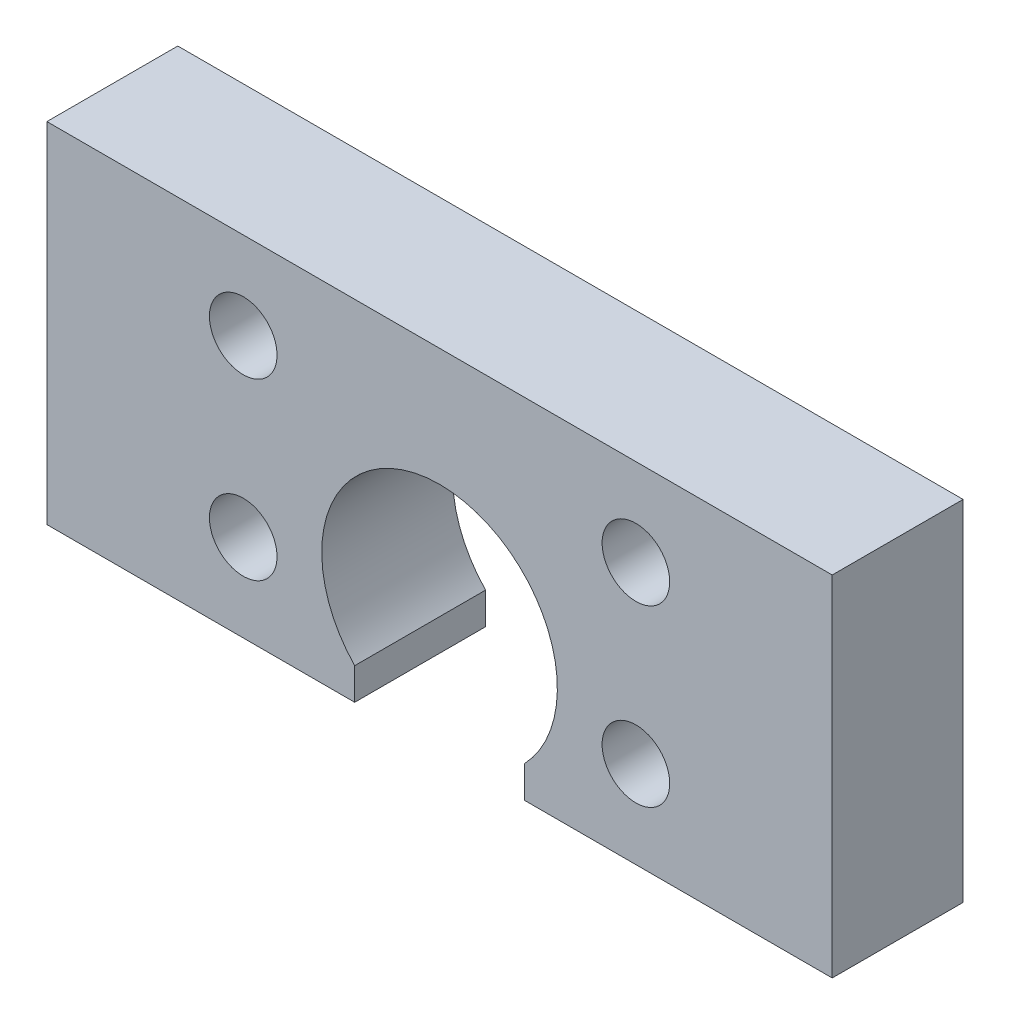
ISO-10303-21;
HEADER;
FILE_DESCRIPTION(('STEP AP214'),'2;1');
FILE_NAME('part.step','',(''),(''),'','','');
FILE_SCHEMA(('AUTOMOTIVE_DESIGN { 1 0 10303 214 1 1 1 1 }'));
ENDSEC;
DATA;
#1=APPLICATION_CONTEXT('core data for automotive mechanical design processes');
#2=APPLICATION_PROTOCOL_DEFINITION('international standard','automotive_design',2000,#1);
#3=PRODUCT_CONTEXT('',#1,'mechanical');
#4=PRODUCT('Part','Part','',(#3));
#5=PRODUCT_RELATED_PRODUCT_CATEGORY('part','',(#4));
#6=PRODUCT_DEFINITION_FORMATION('','',#4);
#7=PRODUCT_DEFINITION_CONTEXT('part definition',#1,'design');
#8=PRODUCT_DEFINITION('design','',#6,#7);
#9=PRODUCT_DEFINITION_SHAPE('','',#8);
#10=(LENGTH_UNIT() NAMED_UNIT(*) SI_UNIT(.MILLI.,.METRE.));
#11=(NAMED_UNIT(*) PLANE_ANGLE_UNIT() SI_UNIT($,.RADIAN.));
#12=(NAMED_UNIT(*) SI_UNIT($,.STERADIAN.) SOLID_ANGLE_UNIT());
#13=UNCERTAINTY_MEASURE_WITH_UNIT(LENGTH_MEASURE(1.E-05),#10,'distance_accuracy_value','');
#14=(GEOMETRIC_REPRESENTATION_CONTEXT(3) GLOBAL_UNCERTAINTY_ASSIGNED_CONTEXT((#13)) GLOBAL_UNIT_ASSIGNED_CONTEXT((#10,
#11,#12)) REPRESENTATION_CONTEXT('',''));
#15=CARTESIAN_POINT('',(0.,0.,0.));
#16=DIRECTION('',(0.,0.,1.));
#17=DIRECTION('',(1.,0.,0.));
#18=AXIS2_PLACEMENT_3D('',#15,#16,#17);
#19=CARTESIAN_POINT('',(71.5029820344726,-16.,-6.));
#20=DIRECTION('',(0.,-1.,0.));
#21=DIRECTION('',(0.,0.,-1.));
#22=AXIS2_PLACEMENT_3D('',#19,#20,#21);
#23=PLANE('',#22);
#24=DIRECTION('',(0.,0.,1.));
#25=VECTOR('',#24,1.);
#26=CARTESIAN_POINT('',(57.3929820344726,-16.,-6.));
#27=LINE('',#26,#25);
#28=CARTESIAN_POINT('',(57.3929820344726,-16.,-6.));
#29=VERTEX_POINT('',#28);
#30=CARTESIAN_POINT('',(57.3929820344726,-16.,0.));
#31=VERTEX_POINT('',#30);
#32=EDGE_CURVE('E152',#29,#31,#27,.T.);
#33=ORIENTED_EDGE('',*,*,#32,.F.);
#34=DIRECTION('',(1.,0.,0.));
#35=VECTOR('',#34,1.);
#36=CARTESIAN_POINT('',(71.5029820344726,-16.,-6.));
#37=LINE('',#36,#35);
#38=CARTESIAN_POINT('',(71.5029820344726,-16.,-6.));
#39=VERTEX_POINT('',#38);
#40=EDGE_CURVE('E65',#29,#39,#37,.T.);
#41=ORIENTED_EDGE('',*,*,#40,.T.);
#42=DIRECTION('',(0.,0.,1.));
#43=VECTOR('',#42,1.);
#44=CARTESIAN_POINT('',(71.5029820344726,-16.,-6.));
#45=LINE('',#44,#43);
#46=CARTESIAN_POINT('',(71.5029820344726,-16.,0.));
#47=VERTEX_POINT('',#46);
#48=EDGE_CURVE('E11',#39,#47,#45,.T.);
#49=ORIENTED_EDGE('',*,*,#48,.T.);
#50=DIRECTION('',(1.,0.,0.));
#51=VECTOR('',#50,1.);
#52=CARTESIAN_POINT('',(71.5029820344726,-16.,0.));
#53=LINE('',#52,#51);
#54=EDGE_CURVE('E89',#31,#47,#53,.T.);
#55=ORIENTED_EDGE('',*,*,#54,.F.);
#56=EDGE_LOOP('',(#33,#41,#49,#55));
#57=FACE_BOUND('',#56,.T.);
#58=ADVANCED_FACE('F40',(#57),#23,.T.);
#59=CARTESIAN_POINT('',(71.5029820344726,0.,-6.));
#60=DIRECTION('',(1.,0.,0.));
#61=DIRECTION('',(0.,0.,-1.));
#62=AXIS2_PLACEMENT_3D('',#59,#60,#61);
#63=PLANE('',#62);
#64=DIRECTION('',(0.,1.,0.));
#65=VECTOR('',#64,1.);
#66=CARTESIAN_POINT('',(71.5029820344726,0.,0.));
#67=LINE('',#66,#65);
#68=CARTESIAN_POINT('',(71.5029820344726,0.,0.));
#69=VERTEX_POINT('',#68);
#70=EDGE_CURVE('E151',#47,#69,#67,.T.);
#71=ORIENTED_EDGE('',*,*,#70,.F.);
#72=ORIENTED_EDGE('',*,*,#48,.F.);
#73=DIRECTION('',(0.,1.,0.));
#74=VECTOR('',#73,1.);
#75=CARTESIAN_POINT('',(71.5029820344726,0.,-6.));
#76=LINE('',#75,#74);
#77=CARTESIAN_POINT('',(71.5029820344726,0.,-6.));
#78=VERTEX_POINT('',#77);
#79=EDGE_CURVE('E155',#39,#78,#76,.T.);
#80=ORIENTED_EDGE('',*,*,#79,.T.);
#81=DIRECTION('',(0.,0.,1.));
#82=VECTOR('',#81,1.);
#83=CARTESIAN_POINT('',(71.5029820344726,0.,-6.));
#84=LINE('',#83,#82);
#85=EDGE_CURVE('E44',#78,#69,#84,.T.);
#86=ORIENTED_EDGE('',*,*,#85,.T.);
#87=EDGE_LOOP('',(#71,#72,#80,#86));
#88=FACE_BOUND('',#87,.T.);
#89=ADVANCED_FACE('F42',(#88),#63,.T.);
#90=DIRECTION('',(0.,0.,1.));
#91=VECTOR('',#90,1.);
#92=CARTESIAN_POINT('',(49.6129820344726,-16.,-6.));
#93=LINE('',#92,#91);
#94=CARTESIAN_POINT('',(49.6129820344726,-16.,-6.));
#95=VERTEX_POINT('',#94);
#96=CARTESIAN_POINT('',(49.6129820344726,-16.,0.));
#97=VERTEX_POINT('',#96);
#98=EDGE_CURVE('E124',#95,#97,#93,.T.);
#99=ORIENTED_EDGE('',*,*,#98,.T.);
#100=CARTESIAN_POINT('',(35.5029820344726,-16.,0.));
#101=VERTEX_POINT('',#100);
#102=EDGE_CURVE('E160',#101,#97,#53,.T.);
#103=ORIENTED_EDGE('',*,*,#102,.F.);
#104=DIRECTION('',(0.,0.,1.));
#105=VECTOR('',#104,1.);
#106=CARTESIAN_POINT('',(35.5029820344726,-16.,-6.));
#107=LINE('',#106,#105);
#108=CARTESIAN_POINT('',(35.5029820344726,-16.,-6.));
#109=VERTEX_POINT('',#108);
#110=EDGE_CURVE('E49',#109,#101,#107,.T.);
#111=ORIENTED_EDGE('',*,*,#110,.F.);
#112=EDGE_CURVE('E166',#109,#95,#37,.T.);
#113=ORIENTED_EDGE('',*,*,#112,.T.);
#114=EDGE_LOOP('',(#99,#103,#111,#113));
#115=FACE_BOUND('',#114,.T.);
#116=ADVANCED_FACE('F203',(#115),#23,.T.);
#117=CARTESIAN_POINT('',(35.5029820344726,0.,-6.));
#118=DIRECTION('',(-1.,0.,0.));
#119=DIRECTION('',(0.,0.,1.));
#120=AXIS2_PLACEMENT_3D('',#117,#118,#119);
#121=PLANE('',#120);
#122=DIRECTION('',(0.,-1.,0.));
#123=VECTOR('',#122,1.);
#124=CARTESIAN_POINT('',(35.5029820344726,0.,0.));
#125=LINE('',#124,#123);
#126=CARTESIAN_POINT('',(35.5029820344726,0.,0.));
#127=VERTEX_POINT('',#126);
#128=EDGE_CURVE('E174',#127,#101,#125,.T.);
#129=ORIENTED_EDGE('',*,*,#128,.F.);
#130=DIRECTION('',(0.,0.,1.));
#131=VECTOR('',#130,1.);
#132=CARTESIAN_POINT('',(35.5029820344726,0.,-6.));
#133=LINE('',#132,#131);
#134=CARTESIAN_POINT('',(35.5029820344726,0.,-6.));
#135=VERTEX_POINT('',#134);
#136=EDGE_CURVE('E179',#135,#127,#133,.T.);
#137=ORIENTED_EDGE('',*,*,#136,.F.);
#138=DIRECTION('',(0.,-1.,0.));
#139=VECTOR('',#138,1.);
#140=CARTESIAN_POINT('',(35.5029820344726,0.,-6.));
#141=LINE('',#140,#139);
#142=EDGE_CURVE('E163',#135,#109,#141,.T.);
#143=ORIENTED_EDGE('',*,*,#142,.T.);
#144=ORIENTED_EDGE('',*,*,#110,.T.);
#145=EDGE_LOOP('',(#129,#137,#143,#144));
#146=FACE_BOUND('',#145,.T.);
#147=ADVANCED_FACE('F209',(#146),#121,.T.);
#148=CARTESIAN_POINT('',(71.5029820344726,0.,-6.));
#149=DIRECTION('',(0.,1.,0.));
#150=DIRECTION('',(-1.,0.,0.));
#151=AXIS2_PLACEMENT_3D('',#148,#149,#150);
#152=PLANE('',#151);
#153=DIRECTION('',(-1.,0.,0.));
#154=VECTOR('',#153,1.);
#155=CARTESIAN_POINT('',(71.5029820344726,0.,0.));
#156=LINE('',#155,#154);
#157=EDGE_CURVE('E170',#69,#127,#156,.T.);
#158=ORIENTED_EDGE('',*,*,#157,.F.);
#159=ORIENTED_EDGE('',*,*,#85,.F.);
#160=DIRECTION('',(-1.,0.,0.));
#161=VECTOR('',#160,1.);
#162=CARTESIAN_POINT('',(71.5029820344726,0.,-6.));
#163=LINE('',#162,#161);
#164=EDGE_CURVE('E159',#78,#135,#163,.T.);
#165=ORIENTED_EDGE('',*,*,#164,.T.);
#166=ORIENTED_EDGE('',*,*,#136,.T.);
#167=EDGE_LOOP('',(#158,#159,#165,#166));
#168=FACE_BOUND('',#167,.T.);
#169=ADVANCED_FACE('F186',(#168),#152,.T.);
#170=CARTESIAN_POINT('',(0.,0.,-6.));
#171=DIRECTION('',(0.,0.,-1.));
#172=DIRECTION('',(-1.,0.,0.));
#173=AXIS2_PLACEMENT_3D('',#170,#171,#172);
#174=PLANE('',#173);
#175=CARTESIAN_POINT('',(62.5029820343425,-4.0000000000023,-6.));
#176=DIRECTION('',(0.,0.,-1.));
#177=DIRECTION('',(-1.,0.,0.));
#178=AXIS2_PLACEMENT_3D('',#175,#176,#177);
#179=CIRCLE('',#178,1.54999999999999);
#180=CARTESIAN_POINT('',(60.9529820343425,-4.0000000000023,-6.));
#181=VERTEX_POINT('',#180);
#182=EDGE_CURVE('E323',#181,#181,#179,.T.);
#183=ORIENTED_EDGE('',*,*,#182,.F.);
#184=EDGE_LOOP('',(#183));
#185=FACE_BOUND('',#184,.T.);
#186=CARTESIAN_POINT('',(62.5029820343425,-12.0000000000023,-6.));
#187=DIRECTION('',(0.,0.,-1.));
#188=DIRECTION('',(-1.,0.,0.));
#189=AXIS2_PLACEMENT_3D('',#186,#187,#188);
#190=CIRCLE('',#189,1.54999999999999);
#191=CARTESIAN_POINT('',(60.9529820343425,-12.0000000000023,-6.));
#192=VERTEX_POINT('',#191);
#193=EDGE_CURVE('E326',#192,#192,#190,.T.);
#194=ORIENTED_EDGE('',*,*,#193,.F.);
#195=EDGE_LOOP('',(#194));
#196=FACE_BOUND('',#195,.T.);
#197=CARTESIAN_POINT('',(44.5029820343425,-4.0000000000023,-6.));
#198=DIRECTION('',(0.,0.,-1.));
#199=DIRECTION('',(-1.,0.,0.));
#200=AXIS2_PLACEMENT_3D('',#197,#198,#199);
#201=CIRCLE('',#200,1.55);
#202=CARTESIAN_POINT('',(42.9529820343425,-4.0000000000023,-6.));
#203=VERTEX_POINT('',#202);
#204=EDGE_CURVE('E332',#203,#203,#201,.T.);
#205=ORIENTED_EDGE('',*,*,#204,.F.);
#206=EDGE_LOOP('',(#205));
#207=FACE_BOUND('',#206,.T.);
#208=CARTESIAN_POINT('',(44.5029820343425,-12.0000000000023,-6.));
#209=DIRECTION('',(0.,0.,-1.));
#210=DIRECTION('',(-1.,0.,0.));
#211=AXIS2_PLACEMENT_3D('',#208,#209,#210);
#212=CIRCLE('',#211,1.55);
#213=CARTESIAN_POINT('',(42.9529820343425,-12.0000000000023,-6.));
#214=VERTEX_POINT('',#213);
#215=EDGE_CURVE('E142',#214,#214,#212,.T.);
#216=ORIENTED_EDGE('',*,*,#215,.F.);
#217=EDGE_LOOP('',(#216));
#218=FACE_BOUND('',#217,.T.);
#219=DIRECTION('',(0.,1.,0.));
#220=VECTOR('',#219,1.);
#221=CARTESIAN_POINT('',(57.3929820344726,-14.93,-6.));
#222=LINE('',#221,#220);
#223=CARTESIAN_POINT('',(57.3929820344726,-14.5453838254577,-6.));
#224=VERTEX_POINT('',#223);
#225=EDGE_CURVE('E125',#29,#224,#222,.T.);
#226=ORIENTED_EDGE('',*,*,#225,.T.);
#227=CARTESIAN_POINT('',(53.5029820344726,-10.8,-6.));
#228=DIRECTION('',(0.,0.,1.));
#229=DIRECTION('',(1.,0.,0.));
#230=AXIS2_PLACEMENT_3D('',#227,#228,#229);
#231=CIRCLE('',#230,5.4);
#232=CARTESIAN_POINT('',(49.6129820344726,-14.5453838254577,-6.));
#233=VERTEX_POINT('',#232);
#234=EDGE_CURVE('E120',#224,#233,#231,.T.);
#235=ORIENTED_EDGE('',*,*,#234,.T.);
#236=DIRECTION('',(0.,-1.,0.));
#237=VECTOR('',#236,1.);
#238=CARTESIAN_POINT('',(49.6129820344726,-14.93,-6.));
#239=LINE('',#238,#237);
#240=EDGE_CURVE('E128',#233,#95,#239,.T.);
#241=ORIENTED_EDGE('',*,*,#240,.T.);
#242=ORIENTED_EDGE('',*,*,#112,.F.);
#243=ORIENTED_EDGE('',*,*,#142,.F.);
#244=ORIENTED_EDGE('',*,*,#164,.F.);
#245=ORIENTED_EDGE('',*,*,#79,.F.);
#246=ORIENTED_EDGE('',*,*,#40,.F.);
#247=EDGE_LOOP('',(#226,#235,#241,#242,#243,#244,#245,#246));
#248=FACE_BOUND('',#247,.T.);
#249=ADVANCED_FACE('F135',(#185,#196,#207,#218,#248),#174,.T.);
#250=CARTESIAN_POINT('',(0.,0.,0.));
#251=DIRECTION('',(0.,0.,-1.));
#252=DIRECTION('',(-1.,0.,0.));
#253=AXIS2_PLACEMENT_3D('',#250,#251,#252);
#254=PLANE('',#253);
#255=CARTESIAN_POINT('',(62.5029820343425,-4.0000000000023,0.));
#256=DIRECTION('',(0.,0.,-1.));
#257=DIRECTION('',(-1.,0.,0.));
#258=AXIS2_PLACEMENT_3D('',#255,#256,#257);
#259=CIRCLE('',#258,1.54999999999999);
#260=CARTESIAN_POINT('',(60.9529820343425,-4.0000000000023,0.));
#261=VERTEX_POINT('',#260);
#262=EDGE_CURVE('E320',#261,#261,#259,.T.);
#263=ORIENTED_EDGE('',*,*,#262,.T.);
#264=EDGE_LOOP('',(#263));
#265=FACE_BOUND('',#264,.T.);
#266=CARTESIAN_POINT('',(62.5029820343425,-12.0000000000023,0.));
#267=DIRECTION('',(0.,0.,-1.));
#268=DIRECTION('',(-1.,0.,0.));
#269=AXIS2_PLACEMENT_3D('',#266,#267,#268);
#270=CIRCLE('',#269,1.54999999999999);
#271=CARTESIAN_POINT('',(60.9529820343425,-12.0000000000023,0.));
#272=VERTEX_POINT('',#271);
#273=EDGE_CURVE('E329',#272,#272,#270,.T.);
#274=ORIENTED_EDGE('',*,*,#273,.T.);
#275=EDGE_LOOP('',(#274));
#276=FACE_BOUND('',#275,.T.);
#277=CARTESIAN_POINT('',(44.5029820343425,-4.0000000000023,0.));
#278=DIRECTION('',(0.,0.,-1.));
#279=DIRECTION('',(-1.,0.,0.));
#280=AXIS2_PLACEMENT_3D('',#277,#278,#279);
#281=CIRCLE('',#280,1.55);
#282=CARTESIAN_POINT('',(42.9529820343425,-4.0000000000023,0.));
#283=VERTEX_POINT('',#282);
#284=EDGE_CURVE('E335',#283,#283,#281,.T.);
#285=ORIENTED_EDGE('',*,*,#284,.T.);
#286=EDGE_LOOP('',(#285));
#287=FACE_BOUND('',#286,.T.);
#288=CARTESIAN_POINT('',(44.5029820343425,-12.0000000000023,0.));
#289=DIRECTION('',(0.,0.,-1.));
#290=DIRECTION('',(-1.,0.,0.));
#291=AXIS2_PLACEMENT_3D('',#288,#289,#290);
#292=CIRCLE('',#291,1.55);
#293=CARTESIAN_POINT('',(42.9529820343425,-12.0000000000023,0.));
#294=VERTEX_POINT('',#293);
#295=EDGE_CURVE('E147',#294,#294,#292,.T.);
#296=ORIENTED_EDGE('',*,*,#295,.T.);
#297=EDGE_LOOP('',(#296));
#298=FACE_BOUND('',#297,.T.);
#299=CARTESIAN_POINT('',(53.5029820344726,-10.8,0.));
#300=DIRECTION('',(0.,0.,1.));
#301=DIRECTION('',(1.,0.,0.));
#302=AXIS2_PLACEMENT_3D('',#299,#300,#301);
#303=CIRCLE('',#302,5.4);
#304=CARTESIAN_POINT('',(57.3929820344726,-14.5453838254577,0.));
#305=VERTEX_POINT('',#304);
#306=CARTESIAN_POINT('',(49.6129820344726,-14.5453838254577,0.));
#307=VERTEX_POINT('',#306);
#308=EDGE_CURVE('E57',#305,#307,#303,.T.);
#309=ORIENTED_EDGE('',*,*,#308,.F.);
#310=DIRECTION('',(0.,1.,0.));
#311=VECTOR('',#310,1.);
#312=CARTESIAN_POINT('',(57.3929820344726,-14.93,0.));
#313=LINE('',#312,#311);
#314=EDGE_CURVE('E136',#31,#305,#313,.T.);
#315=ORIENTED_EDGE('',*,*,#314,.F.);
#316=ORIENTED_EDGE('',*,*,#54,.T.);
#317=ORIENTED_EDGE('',*,*,#70,.T.);
#318=ORIENTED_EDGE('',*,*,#157,.T.);
#319=ORIENTED_EDGE('',*,*,#128,.T.);
#320=ORIENTED_EDGE('',*,*,#102,.T.);
#321=DIRECTION('',(0.,-1.,0.));
#322=VECTOR('',#321,1.);
#323=CARTESIAN_POINT('',(49.6129820344726,-14.93,0.));
#324=LINE('',#323,#322);
#325=EDGE_CURVE('E139',#307,#97,#324,.T.);
#326=ORIENTED_EDGE('',*,*,#325,.F.);
#327=EDGE_LOOP('',(#309,#315,#316,#317,#318,#319,#320,#326));
#328=FACE_BOUND('',#327,.T.);
#329=ADVANCED_FACE('F187',(#265,#276,#287,#298,#328),#254,.F.);
#330=CARTESIAN_POINT('',(53.5029820344726,-10.8,-6.));
#331=DIRECTION('',(0.,0.,1.));
#332=DIRECTION('',(1.,0.,0.));
#333=AXIS2_PLACEMENT_3D('',#330,#331,#332);
#334=CYLINDRICAL_SURFACE('',#333,5.4);
#335=ORIENTED_EDGE('',*,*,#308,.T.);
#336=DIRECTION('',(0.,0.,1.));
#337=VECTOR('',#336,1.);
#338=CARTESIAN_POINT('',(49.6129820344726,-14.5453838254577,-6.));
#339=LINE('',#338,#337);
#340=EDGE_CURVE('E116',#233,#307,#339,.T.);
#341=ORIENTED_EDGE('',*,*,#340,.F.);
#342=ORIENTED_EDGE('',*,*,#234,.F.);
#343=DIRECTION('',(0.,0.,1.));
#344=VECTOR('',#343,1.);
#345=CARTESIAN_POINT('',(57.3929820344726,-14.5453838254577,-6.));
#346=LINE('',#345,#344);
#347=EDGE_CURVE('E149',#224,#305,#346,.T.);
#348=ORIENTED_EDGE('',*,*,#347,.T.);
#349=EDGE_LOOP('',(#335,#341,#342,#348));
#350=FACE_BOUND('',#349,.T.);
#351=ADVANCED_FACE('F118',(#350),#334,.F.);
#352=CARTESIAN_POINT('',(57.3929820344726,-14.93,-6.));
#353=DIRECTION('',(1.,0.,0.));
#354=DIRECTION('',(0.,0.,-1.));
#355=AXIS2_PLACEMENT_3D('',#352,#353,#354);
#356=PLANE('',#355);
#357=ORIENTED_EDGE('',*,*,#314,.T.);
#358=ORIENTED_EDGE('',*,*,#347,.F.);
#359=ORIENTED_EDGE('',*,*,#225,.F.);
#360=ORIENTED_EDGE('',*,*,#32,.T.);
#361=EDGE_LOOP('',(#357,#358,#359,#360));
#362=FACE_BOUND('',#361,.T.);
#363=ADVANCED_FACE('F195',(#362),#356,.F.);
#364=CARTESIAN_POINT('',(49.6129820344726,-14.93,-6.));
#365=DIRECTION('',(-1.,0.,0.));
#366=DIRECTION('',(0.,0.,1.));
#367=AXIS2_PLACEMENT_3D('',#364,#365,#366);
#368=PLANE('',#367);
#369=ORIENTED_EDGE('',*,*,#325,.T.);
#370=ORIENTED_EDGE('',*,*,#98,.F.);
#371=ORIENTED_EDGE('',*,*,#240,.F.);
#372=ORIENTED_EDGE('',*,*,#340,.T.);
#373=EDGE_LOOP('',(#369,#370,#371,#372));
#374=FACE_BOUND('',#373,.T.);
#375=ADVANCED_FACE('F129',(#374),#368,.F.);
#376=CARTESIAN_POINT('',(44.5029820343425,-12.0000000000023,0.));
#377=DIRECTION('',(0.,0.,-1.));
#378=DIRECTION('',(-1.,0.,0.));
#379=AXIS2_PLACEMENT_3D('',#376,#377,#378);
#380=CYLINDRICAL_SURFACE('',#379,1.55);
#381=ORIENTED_EDGE('',*,*,#295,.F.);
#382=EDGE_LOOP('',(#381));
#383=FACE_BOUND('',#382,.T.);
#384=ORIENTED_EDGE('',*,*,#215,.T.);
#385=EDGE_LOOP('',(#384));
#386=FACE_BOUND('',#385,.T.);
#387=ADVANCED_FACE('F274',(#383,#386),#380,.F.);
#388=CARTESIAN_POINT('',(44.5029820343425,-4.0000000000023,0.));
#389=DIRECTION('',(0.,0.,-1.));
#390=DIRECTION('',(-1.,0.,0.));
#391=AXIS2_PLACEMENT_3D('',#388,#389,#390);
#392=CYLINDRICAL_SURFACE('',#391,1.55);
#393=ORIENTED_EDGE('',*,*,#284,.F.);
#394=EDGE_LOOP('',(#393));
#395=FACE_BOUND('',#394,.T.);
#396=ORIENTED_EDGE('',*,*,#204,.T.);
#397=EDGE_LOOP('',(#396));
#398=FACE_BOUND('',#397,.T.);
#399=ADVANCED_FACE('F284',(#395,#398),#392,.F.);
#400=CARTESIAN_POINT('',(62.5029820343425,-12.0000000000023,0.));
#401=DIRECTION('',(0.,0.,-1.));
#402=DIRECTION('',(-1.,0.,0.));
#403=AXIS2_PLACEMENT_3D('',#400,#401,#402);
#404=CYLINDRICAL_SURFACE('',#403,1.54999999999999);
#405=ORIENTED_EDGE('',*,*,#273,.F.);
#406=EDGE_LOOP('',(#405));
#407=FACE_BOUND('',#406,.T.);
#408=ORIENTED_EDGE('',*,*,#193,.T.);
#409=EDGE_LOOP('',(#408));
#410=FACE_BOUND('',#409,.T.);
#411=ADVANCED_FACE('F291',(#407,#410),#404,.F.);
#412=CARTESIAN_POINT('',(62.5029820343425,-4.0000000000023,0.));
#413=DIRECTION('',(0.,0.,-1.));
#414=DIRECTION('',(-1.,0.,0.));
#415=AXIS2_PLACEMENT_3D('',#412,#413,#414);
#416=CYLINDRICAL_SURFACE('',#415,1.54999999999999);
#417=ORIENTED_EDGE('',*,*,#262,.F.);
#418=EDGE_LOOP('',(#417));
#419=FACE_BOUND('',#418,.T.);
#420=ORIENTED_EDGE('',*,*,#182,.T.);
#421=EDGE_LOOP('',(#420));
#422=FACE_BOUND('',#421,.T.);
#423=ADVANCED_FACE('F299',(#419,#422),#416,.F.);
#424=CLOSED_SHELL('',(#58,#89,#116,#147,#169,#249,#329,#351,#363,#375,#387,#399,#411,#423));
#425=MANIFOLD_SOLID_BREP('B2',#424);
#426=ADVANCED_BREP_SHAPE_REPRESENTATION('',(#18,#425),#14);
#427=SHAPE_DEFINITION_REPRESENTATION(#9,#426);
ENDSEC;
END-ISO-10303-21;
